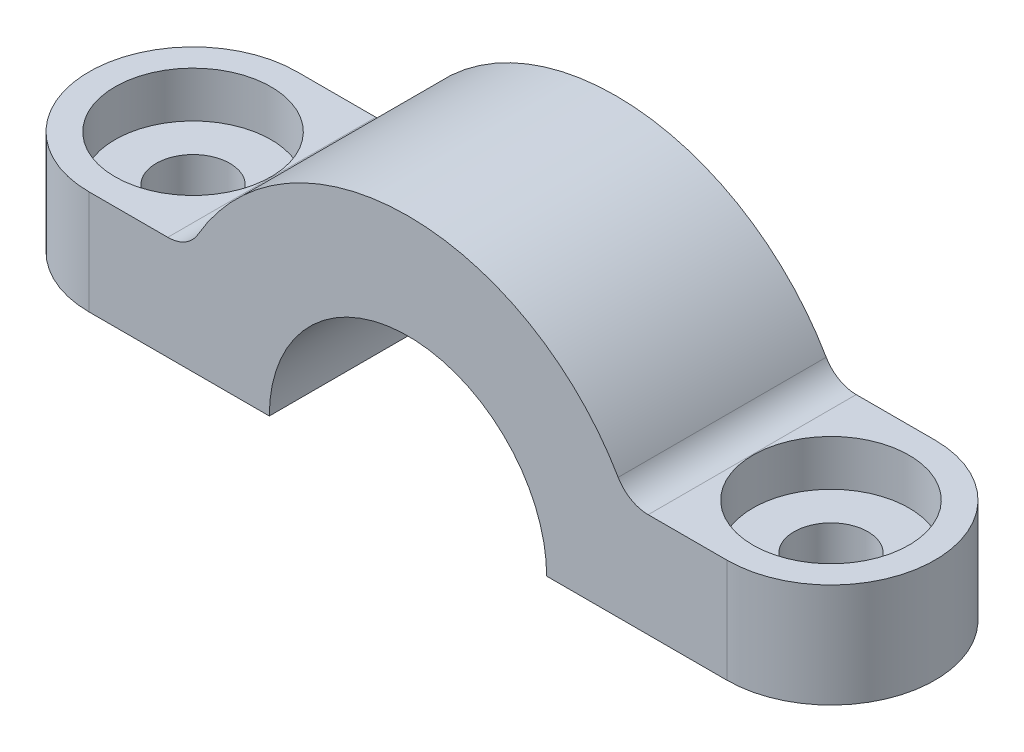
ISO-10303-21;
HEADER;
FILE_DESCRIPTION(('STEP AP214'),'2;1');
FILE_NAME('part.step','',(''),(''),'','','');
FILE_SCHEMA(('AUTOMOTIVE_DESIGN { 1 0 10303 214 1 1 1 1 }'));
ENDSEC;
DATA;
#1=APPLICATION_CONTEXT('core data for automotive mechanical design processes');
#2=APPLICATION_PROTOCOL_DEFINITION('international standard','automotive_design',2000,#1);
#3=PRODUCT_CONTEXT('',#1,'mechanical');
#4=PRODUCT('Part','Part','',(#3));
#5=PRODUCT_RELATED_PRODUCT_CATEGORY('part','',(#4));
#6=PRODUCT_DEFINITION_FORMATION('','',#4);
#7=PRODUCT_DEFINITION_CONTEXT('part definition',#1,'design');
#8=PRODUCT_DEFINITION('design','',#6,#7);
#9=PRODUCT_DEFINITION_SHAPE('','',#8);
#10=(LENGTH_UNIT() NAMED_UNIT(*) SI_UNIT(.MILLI.,.METRE.));
#11=(NAMED_UNIT(*) PLANE_ANGLE_UNIT() SI_UNIT($,.RADIAN.));
#12=(NAMED_UNIT(*) SI_UNIT($,.STERADIAN.) SOLID_ANGLE_UNIT());
#13=UNCERTAINTY_MEASURE_WITH_UNIT(LENGTH_MEASURE(1.E-05),#10,'distance_accuracy_value','');
#14=(GEOMETRIC_REPRESENTATION_CONTEXT(3) GLOBAL_UNCERTAINTY_ASSIGNED_CONTEXT((#13)) GLOBAL_UNIT_ASSIGNED_CONTEXT((#10,
#11,#12)) REPRESENTATION_CONTEXT('',''));
#15=CARTESIAN_POINT('',(0.,0.,0.));
#16=DIRECTION('',(0.,0.,1.));
#17=DIRECTION('',(1.,0.,0.));
#18=AXIS2_PLACEMENT_3D('',#15,#16,#17);
#19=CARTESIAN_POINT('',(0.,0.,9.525));
#20=DIRECTION('',(0.,0.,-1.));
#21=DIRECTION('',(-1.,0.,0.));
#22=AXIS2_PLACEMENT_3D('',#19,#20,#21);
#23=CYLINDRICAL_SURFACE('',#22,22.225);
#24=CARTESIAN_POINT('',(0.,0.,9.525));
#25=DIRECTION('',(0.,0.,1.));
#26=DIRECTION('',(-1.,0.,0.));
#27=AXIS2_PLACEMENT_3D('',#24,#25,#26);
#28=CIRCLE('',#27,22.225);
#29=CARTESIAN_POINT('',(19.2474145991092,11.1125,9.52499999999999));
#30=VERTEX_POINT('',#29);
#31=CARTESIAN_POINT('',(-19.2474145991092,11.1125,9.52500000000001));
#32=VERTEX_POINT('',#31);
#33=EDGE_CURVE('E162',#30,#32,#28,.T.);
#34=ORIENTED_EDGE('',*,*,#33,.F.);
#35=DIRECTION('',(0.,0.,-1.));
#36=VECTOR('',#35,1.);
#37=CARTESIAN_POINT('',(19.2474145991092,11.1125,9.52499999999999));
#38=LINE('',#37,#36);
#39=CARTESIAN_POINT('',(19.2474145991092,11.1125,-9.52500000000001));
#40=VERTEX_POINT('',#39);
#41=EDGE_CURVE('E187',#30,#40,#38,.T.);
#42=ORIENTED_EDGE('',*,*,#41,.T.);
#43=CARTESIAN_POINT('',(0.,0.,-9.52500000000001));
#44=DIRECTION('',(0.,0.,1.));
#45=DIRECTION('',(-1.,0.,0.));
#46=AXIS2_PLACEMENT_3D('',#43,#44,#45);
#47=CIRCLE('',#46,22.225);
#48=CARTESIAN_POINT('',(-19.2474145991092,11.1125,-9.52500000000001));
#49=VERTEX_POINT('',#48);
#50=EDGE_CURVE('E159',#40,#49,#47,.T.);
#51=ORIENTED_EDGE('',*,*,#50,.T.);
#52=DIRECTION('',(0.,0.,-1.));
#53=VECTOR('',#52,1.);
#54=CARTESIAN_POINT('',(-19.2474145991092,11.1125,9.52500000000001));
#55=LINE('',#54,#53);
#56=EDGE_CURVE('E184',#49,#32,#55,.F.);
#57=ORIENTED_EDGE('',*,*,#56,.T.);
#58=EDGE_LOOP('',(#34,#42,#51,#57));
#59=FACE_BOUND('',#58,.T.);
#60=ADVANCED_FACE('F36',(#59),#23,.T.);
#61=CARTESIAN_POINT('',(-22.225,0.,9.525));
#62=DIRECTION('',(0.,1.,0.));
#63=DIRECTION('',(0.,0.,1.));
#64=AXIS2_PLACEMENT_3D('',#61,#62,#63);
#65=PLANE('',#64);
#66=CARTESIAN_POINT('',(-29.21,0.,0.));
#67=DIRECTION('',(0.,1.,0.));
#68=DIRECTION('',(0.,0.,1.));
#69=AXIS2_PLACEMENT_3D('',#66,#67,#68);
#70=CIRCLE('',#69,3.37820000000001);
#71=CARTESIAN_POINT('',(-29.21,0.,3.3782));
#72=VERTEX_POINT('',#71);
#73=EDGE_CURVE('E364',#72,#72,#70,.T.);
#74=ORIENTED_EDGE('',*,*,#73,.T.);
#75=EDGE_LOOP('',(#74));
#76=FACE_BOUND('',#75,.T.);
#77=DIRECTION('',(1.,0.,0.));
#78=VECTOR('',#77,1.);
#79=CARTESIAN_POINT('',(-22.2250000000001,0.,-9.52499999999999));
#80=LINE('',#79,#78);
#81=CARTESIAN_POINT('',(-29.21,0.,-9.52500000000001));
#82=VERTEX_POINT('',#81);
#83=CARTESIAN_POINT('',(-12.7,0.,-9.52500000000001));
#84=VERTEX_POINT('',#83);
#85=EDGE_CURVE('E173',#82,#84,#80,.T.);
#86=ORIENTED_EDGE('',*,*,#85,.T.);
#87=DIRECTION('',(0.,0.,-1.));
#88=VECTOR('',#87,1.);
#89=CARTESIAN_POINT('',(-12.7,0.,9.525));
#90=LINE('',#89,#88);
#91=CARTESIAN_POINT('',(-12.7,0.,9.525));
#92=VERTEX_POINT('',#91);
#93=EDGE_CURVE('E180',#92,#84,#90,.T.);
#94=ORIENTED_EDGE('',*,*,#93,.F.);
#95=DIRECTION('',(1.,0.,0.));
#96=VECTOR('',#95,1.);
#97=CARTESIAN_POINT('',(-22.225,0.,9.525));
#98=LINE('',#97,#96);
#99=CARTESIAN_POINT('',(-29.21,0.,9.52499999999999));
#100=VERTEX_POINT('',#99);
#101=EDGE_CURVE('E164',#100,#92,#98,.T.);
#102=ORIENTED_EDGE('',*,*,#101,.F.);
#103=CARTESIAN_POINT('',(-29.21,0.,0.));
#104=DIRECTION('',(0.,-1.,0.));
#105=DIRECTION('',(0.,0.,1.));
#106=AXIS2_PLACEMENT_3D('',#103,#104,#105);
#107=CIRCLE('',#106,9.525);
#108=EDGE_CURVE('E144',#100,#82,#107,.T.);
#109=ORIENTED_EDGE('',*,*,#108,.T.);
#110=EDGE_LOOP('',(#86,#94,#102,#109));
#111=FACE_BOUND('',#110,.T.);
#112=ADVANCED_FACE('F216',(#76,#111),#65,.F.);
#113=CARTESIAN_POINT('',(0.,0.,9.525));
#114=DIRECTION('',(0.,0.,-1.));
#115=DIRECTION('',(-1.,0.,0.));
#116=AXIS2_PLACEMENT_3D('',#113,#114,#115);
#117=CYLINDRICAL_SURFACE('',#116,12.7);
#118=CARTESIAN_POINT('',(0.,0.,-9.52500000000001));
#119=DIRECTION('',(0.,0.,-1.));
#120=DIRECTION('',(1.,0.,0.));
#121=AXIS2_PLACEMENT_3D('',#118,#119,#120);
#122=CIRCLE('',#121,12.7);
#123=CARTESIAN_POINT('',(12.7,0.,-9.52500000000001));
#124=VERTEX_POINT('',#123);
#125=EDGE_CURVE('E175',#84,#124,#122,.T.);
#126=ORIENTED_EDGE('',*,*,#125,.T.);
#127=DIRECTION('',(0.,0.,-1.));
#128=VECTOR('',#127,1.);
#129=CARTESIAN_POINT('',(12.7,0.,9.525));
#130=LINE('',#129,#128);
#131=CARTESIAN_POINT('',(12.7,0.,9.525));
#132=VERTEX_POINT('',#131);
#133=EDGE_CURVE('E170',#132,#124,#130,.T.);
#134=ORIENTED_EDGE('',*,*,#133,.F.);
#135=CARTESIAN_POINT('',(0.,0.,9.525));
#136=DIRECTION('',(0.,0.,-1.));
#137=DIRECTION('',(1.,0.,0.));
#138=AXIS2_PLACEMENT_3D('',#135,#136,#137);
#139=CIRCLE('',#138,12.7);
#140=EDGE_CURVE('E167',#92,#132,#139,.T.);
#141=ORIENTED_EDGE('',*,*,#140,.F.);
#142=ORIENTED_EDGE('',*,*,#93,.T.);
#143=EDGE_LOOP('',(#126,#134,#141,#142));
#144=FACE_BOUND('',#143,.T.);
#145=ADVANCED_FACE('F219',(#144),#117,.F.);
#146=CARTESIAN_POINT('',(12.7,0.,9.525));
#147=DIRECTION('',(0.,1.,0.));
#148=DIRECTION('',(0.,0.,1.));
#149=AXIS2_PLACEMENT_3D('',#146,#147,#148);
#150=PLANE('',#149);
#151=CARTESIAN_POINT('',(29.21,0.,0.));
#152=DIRECTION('',(0.,1.,0.));
#153=DIRECTION('',(0.,0.,1.));
#154=AXIS2_PLACEMENT_3D('',#151,#152,#153);
#155=CIRCLE('',#154,3.37820000000001);
#156=CARTESIAN_POINT('',(29.21,0.,3.37820000000002));
#157=VERTEX_POINT('',#156);
#158=EDGE_CURVE('E138',#157,#157,#155,.T.);
#159=ORIENTED_EDGE('',*,*,#158,.T.);
#160=EDGE_LOOP('',(#159));
#161=FACE_BOUND('',#160,.T.);
#162=DIRECTION('',(1.,0.,0.));
#163=VECTOR('',#162,1.);
#164=CARTESIAN_POINT('',(12.7,0.,-9.52500000000001));
#165=LINE('',#164,#163);
#166=CARTESIAN_POINT('',(29.21,0.,-9.525));
#167=VERTEX_POINT('',#166);
#168=EDGE_CURVE('E165',#124,#167,#165,.T.);
#169=ORIENTED_EDGE('',*,*,#168,.T.);
#170=CARTESIAN_POINT('',(29.21,0.,0.));
#171=DIRECTION('',(0.,-1.,0.));
#172=DIRECTION('',(0.,0.,-1.));
#173=AXIS2_PLACEMENT_3D('',#170,#171,#172);
#174=CIRCLE('',#173,9.525);
#175=CARTESIAN_POINT('',(29.21,0.,9.525));
#176=VERTEX_POINT('',#175);
#177=EDGE_CURVE('E136',#167,#176,#174,.T.);
#178=ORIENTED_EDGE('',*,*,#177,.T.);
#179=DIRECTION('',(1.,0.,0.));
#180=VECTOR('',#179,1.);
#181=CARTESIAN_POINT('',(12.7,0.,9.525));
#182=LINE('',#181,#180);
#183=EDGE_CURVE('E116',#132,#176,#182,.T.);
#184=ORIENTED_EDGE('',*,*,#183,.F.);
#185=ORIENTED_EDGE('',*,*,#133,.T.);
#186=EDGE_LOOP('',(#169,#178,#184,#185));
#187=FACE_BOUND('',#186,.T.);
#188=ADVANCED_FACE('F221',(#161,#187),#150,.F.);
#189=CARTESIAN_POINT('',(0.,0.,9.525));
#190=DIRECTION('',(0.,0.,-1.));
#191=DIRECTION('',(-1.,0.,0.));
#192=AXIS2_PLACEMENT_3D('',#189,#190,#191);
#193=PLANE('',#192);
#194=ORIENTED_EDGE('',*,*,#140,.T.);
#195=ORIENTED_EDGE('',*,*,#183,.T.);
#196=DIRECTION('',(0.,-1.,0.));
#197=VECTOR('',#196,1.);
#198=CARTESIAN_POINT('',(29.21,9.52499999999996,9.525));
#199=LINE('',#198,#197);
#200=CARTESIAN_POINT('',(29.21,9.52499999999996,9.525));
#201=VERTEX_POINT('',#200);
#202=EDGE_CURVE('E111',#201,#176,#199,.T.);
#203=ORIENTED_EDGE('',*,*,#202,.F.);
#204=DIRECTION('',(-1.,0.,0.));
#205=VECTOR('',#204,1.);
#206=CARTESIAN_POINT('',(29.21,9.52499999999996,9.525));
#207=LINE('',#206,#205);
#208=CARTESIAN_POINT('',(21.9970452561248,9.52500000000001,9.52500000000001));
#209=VERTEX_POINT('',#208);
#210=EDGE_CURVE('E114',#201,#209,#207,.T.);
#211=ORIENTED_EDGE('',*,*,#210,.T.);
#212=CARTESIAN_POINT('',(21.9970452561248,12.6999999999999,9.52500000000002));
#213=DIRECTION('',(0.,0.,-1.));
#214=DIRECTION('',(-1.,0.,0.));
#215=AXIS2_PLACEMENT_3D('',#212,#213,#214);
#216=CIRCLE('',#215,3.175);
#217=EDGE_CURVE('E190',#209,#30,#216,.T.);
#218=ORIENTED_EDGE('',*,*,#217,.T.);
#219=ORIENTED_EDGE('',*,*,#33,.T.);
#220=CARTESIAN_POINT('',(-21.9970452561248,12.6999999999999,9.52499999999998));
#221=DIRECTION('',(0.,0.,-1.));
#222=DIRECTION('',(-1.,0.,0.));
#223=AXIS2_PLACEMENT_3D('',#220,#221,#222);
#224=CIRCLE('',#223,3.175);
#225=CARTESIAN_POINT('',(-21.9970452561248,9.52499999999996,9.52500000000001));
#226=VERTEX_POINT('',#225);
#227=EDGE_CURVE('E44',#32,#226,#224,.T.);
#228=ORIENTED_EDGE('',*,*,#227,.T.);
#229=DIRECTION('',(-1.,0.,0.));
#230=VECTOR('',#229,1.);
#231=CARTESIAN_POINT('',(-29.21,9.52499999999996,9.52499999999999));
#232=LINE('',#231,#230);
#233=CARTESIAN_POINT('',(-29.21,9.52499999999996,9.52499999999999));
#234=VERTEX_POINT('',#233);
#235=EDGE_CURVE('E146',#226,#234,#232,.T.);
#236=ORIENTED_EDGE('',*,*,#235,.T.);
#237=DIRECTION('',(0.,-1.,0.));
#238=VECTOR('',#237,1.);
#239=CARTESIAN_POINT('',(-29.21,9.52499999999996,9.52499999999999));
#240=LINE('',#239,#238);
#241=EDGE_CURVE('E153',#234,#100,#240,.T.);
#242=ORIENTED_EDGE('',*,*,#241,.T.);
#243=ORIENTED_EDGE('',*,*,#101,.T.);
#244=EDGE_LOOP('',(#194,#195,#203,#211,#218,#219,#228,#236,#242,#243));
#245=FACE_BOUND('',#244,.T.);
#246=ADVANCED_FACE('F113',(#245),#193,.F.);
#247=CARTESIAN_POINT('',(0.,0.,-9.52500000000001));
#248=DIRECTION('',(0.,0.,-1.));
#249=DIRECTION('',(-1.,0.,0.));
#250=AXIS2_PLACEMENT_3D('',#247,#248,#249);
#251=PLANE('',#250);
#252=ORIENTED_EDGE('',*,*,#168,.F.);
#253=ORIENTED_EDGE('',*,*,#125,.F.);
#254=ORIENTED_EDGE('',*,*,#85,.F.);
#255=DIRECTION('',(0.,-1.,0.));
#256=VECTOR('',#255,1.);
#257=CARTESIAN_POINT('',(-29.21,9.52499999999996,-9.52500000000001));
#258=LINE('',#257,#256);
#259=CARTESIAN_POINT('',(-29.21,9.52499999999996,-9.52500000000001));
#260=VERTEX_POINT('',#259);
#261=EDGE_CURVE('E156',#260,#82,#258,.T.);
#262=ORIENTED_EDGE('',*,*,#261,.F.);
#263=DIRECTION('',(1.,0.,0.));
#264=VECTOR('',#263,1.);
#265=CARTESIAN_POINT('',(-12.7,9.52500000000001,-9.52500000000001));
#266=LINE('',#265,#264);
#267=CARTESIAN_POINT('',(-21.9970452561248,9.52500000000001,-9.52500000000001));
#268=VERTEX_POINT('',#267);
#269=EDGE_CURVE('E151',#260,#268,#266,.T.);
#270=ORIENTED_EDGE('',*,*,#269,.T.);
#271=CARTESIAN_POINT('',(-21.9970452561248,12.6999999999999,-9.52500000000001));
#272=DIRECTION('',(0.,0.,-1.));
#273=DIRECTION('',(-1.,0.,0.));
#274=AXIS2_PLACEMENT_3D('',#271,#272,#273);
#275=CIRCLE('',#274,3.175);
#276=EDGE_CURVE('E11',#268,#49,#275,.F.);
#277=ORIENTED_EDGE('',*,*,#276,.T.);
#278=ORIENTED_EDGE('',*,*,#50,.F.);
#279=CARTESIAN_POINT('',(21.9970452561248,12.7,-9.525));
#280=DIRECTION('',(0.,0.,-1.));
#281=DIRECTION('',(-1.,0.,0.));
#282=AXIS2_PLACEMENT_3D('',#279,#280,#281);
#283=CIRCLE('',#282,3.175);
#284=CARTESIAN_POINT('',(21.9970452561248,9.52500000000001,-9.525));
#285=VERTEX_POINT('',#284);
#286=EDGE_CURVE('E192',#40,#285,#283,.F.);
#287=ORIENTED_EDGE('',*,*,#286,.T.);
#288=DIRECTION('',(1.,0.,0.));
#289=VECTOR('',#288,1.);
#290=CARTESIAN_POINT('',(12.7,9.52500000000006,-9.52500000000001));
#291=LINE('',#290,#289);
#292=CARTESIAN_POINT('',(29.21,9.52500000000001,-9.52499999999999));
#293=VERTEX_POINT('',#292);
#294=EDGE_CURVE('E122',#285,#293,#291,.T.);
#295=ORIENTED_EDGE('',*,*,#294,.T.);
#296=DIRECTION('',(0.,-1.,0.));
#297=VECTOR('',#296,1.);
#298=CARTESIAN_POINT('',(29.21,9.52500000000001,-9.52499999999999));
#299=LINE('',#298,#297);
#300=EDGE_CURVE('E121',#293,#167,#299,.T.);
#301=ORIENTED_EDGE('',*,*,#300,.T.);
#302=EDGE_LOOP('',(#252,#253,#254,#262,#270,#277,#278,#287,#295,#301));
#303=FACE_BOUND('',#302,.T.);
#304=ADVANCED_FACE('F197',(#303),#251,.T.);
#305=CARTESIAN_POINT('',(-29.21,9.52499999999996,0.));
#306=DIRECTION('',(0.,1.,0.));
#307=DIRECTION('',(0.,0.,1.));
#308=AXIS2_PLACEMENT_3D('',#305,#306,#307);
#309=PLANE('',#308);
#310=CARTESIAN_POINT('',(-29.21,9.52499999999996,0.));
#311=DIRECTION('',(0.,1.,0.));
#312=DIRECTION('',(0.,0.,1.));
#313=AXIS2_PLACEMENT_3D('',#310,#311,#312);
#314=CIRCLE('',#313,7.14374999999999);
#315=CARTESIAN_POINT('',(-29.21,9.52499999999996,7.14374999999998));
#316=VERTEX_POINT('',#315);
#317=EDGE_CURVE('E357',#316,#316,#314,.T.);
#318=ORIENTED_EDGE('',*,*,#317,.F.);
#319=EDGE_LOOP('',(#318));
#320=FACE_BOUND('',#319,.T.);
#321=ORIENTED_EDGE('',*,*,#235,.F.);
#322=DIRECTION('',(0.,0.,-1.));
#323=VECTOR('',#322,1.);
#324=CARTESIAN_POINT('',(-21.9970452561248,9.52500000000001,0.));
#325=LINE('',#324,#323);
#326=EDGE_CURVE('E57',#226,#268,#325,.T.);
#327=ORIENTED_EDGE('',*,*,#326,.T.);
#328=ORIENTED_EDGE('',*,*,#269,.F.);
#329=CARTESIAN_POINT('',(-29.21,9.52499999999996,0.));
#330=DIRECTION('',(0.,-1.,0.));
#331=DIRECTION('',(0.,0.,1.));
#332=AXIS2_PLACEMENT_3D('',#329,#330,#331);
#333=CIRCLE('',#332,9.525);
#334=EDGE_CURVE('E148',#234,#260,#333,.T.);
#335=ORIENTED_EDGE('',*,*,#334,.F.);
#336=EDGE_LOOP('',(#321,#327,#328,#335));
#337=FACE_BOUND('',#336,.T.);
#338=ADVANCED_FACE('F207',(#320,#337),#309,.T.);
#339=CARTESIAN_POINT('',(-29.21,9.52499999999996,0.));
#340=DIRECTION('',(0.,-1.,0.));
#341=DIRECTION('',(0.,0.,-1.));
#342=AXIS2_PLACEMENT_3D('',#339,#340,#341);
#343=CYLINDRICAL_SURFACE('',#342,9.525);
#344=ORIENTED_EDGE('',*,*,#108,.F.);
#345=ORIENTED_EDGE('',*,*,#241,.F.);
#346=ORIENTED_EDGE('',*,*,#334,.T.);
#347=ORIENTED_EDGE('',*,*,#261,.T.);
#348=EDGE_LOOP('',(#344,#345,#346,#347));
#349=FACE_BOUND('',#348,.T.);
#350=ADVANCED_FACE('F211',(#349),#343,.T.);
#351=CARTESIAN_POINT('',(29.2100000000001,9.52500000000001,0.));
#352=DIRECTION('',(0.,-1.,0.));
#353=DIRECTION('',(0.,0.,-1.));
#354=AXIS2_PLACEMENT_3D('',#351,#352,#353);
#355=PLANE('',#354);
#356=CARTESIAN_POINT('',(29.2100000000001,9.52500000000001,0.));
#357=DIRECTION('',(0.,1.,0.));
#358=DIRECTION('',(0.,0.,1.));
#359=AXIS2_PLACEMENT_3D('',#356,#357,#358);
#360=CIRCLE('',#359,7.14374999999999);
#361=CARTESIAN_POINT('',(29.2100000000001,9.52500000000001,7.14374999999999));
#362=VERTEX_POINT('',#361);
#363=EDGE_CURVE('E367',#362,#362,#360,.T.);
#364=ORIENTED_EDGE('',*,*,#363,.F.);
#365=EDGE_LOOP('',(#364));
#366=FACE_BOUND('',#365,.T.);
#367=ORIENTED_EDGE('',*,*,#294,.F.);
#368=DIRECTION('',(0.,0.,1.));
#369=VECTOR('',#368,1.);
#370=CARTESIAN_POINT('',(21.9970452561248,9.52500000000001,9.52500000000001));
#371=LINE('',#370,#369);
#372=EDGE_CURVE('E131',#285,#209,#371,.T.);
#373=ORIENTED_EDGE('',*,*,#372,.T.);
#374=ORIENTED_EDGE('',*,*,#210,.F.);
#375=CARTESIAN_POINT('',(29.2100000000001,9.52500000000001,0.));
#376=DIRECTION('',(0.,-1.,0.));
#377=DIRECTION('',(0.,0.,-1.));
#378=AXIS2_PLACEMENT_3D('',#375,#376,#377);
#379=CIRCLE('',#378,9.525);
#380=EDGE_CURVE('E129',#293,#201,#379,.T.);
#381=ORIENTED_EDGE('',*,*,#380,.F.);
#382=EDGE_LOOP('',(#367,#373,#374,#381));
#383=FACE_BOUND('',#382,.T.);
#384=ADVANCED_FACE('F128',(#366,#383),#355,.F.);
#385=CARTESIAN_POINT('',(29.2100000000001,9.52500000000001,0.));
#386=DIRECTION('',(0.,-1.,0.));
#387=DIRECTION('',(0.,0.,-1.));
#388=AXIS2_PLACEMENT_3D('',#385,#386,#387);
#389=CYLINDRICAL_SURFACE('',#388,9.525);
#390=ORIENTED_EDGE('',*,*,#177,.F.);
#391=ORIENTED_EDGE('',*,*,#300,.F.);
#392=ORIENTED_EDGE('',*,*,#380,.T.);
#393=ORIENTED_EDGE('',*,*,#202,.T.);
#394=EDGE_LOOP('',(#390,#391,#392,#393));
#395=FACE_BOUND('',#394,.T.);
#396=ADVANCED_FACE('F134',(#395),#389,.T.);
#397=CARTESIAN_POINT('',(21.9970452561248,12.6999999999999,9.52500000000002));
#398=DIRECTION('',(0.,0.,-1.));
#399=DIRECTION('',(-1.,0.,0.));
#400=AXIS2_PLACEMENT_3D('',#397,#398,#399);
#401=CYLINDRICAL_SURFACE('',#400,3.175);
#402=ORIENTED_EDGE('',*,*,#286,.F.);
#403=ORIENTED_EDGE('',*,*,#41,.F.);
#404=ORIENTED_EDGE('',*,*,#217,.F.);
#405=ORIENTED_EDGE('',*,*,#372,.F.);
#406=EDGE_LOOP('',(#402,#403,#404,#405));
#407=FACE_BOUND('',#406,.T.);
#408=ADVANCED_FACE('F200',(#407),#401,.F.);
#409=CARTESIAN_POINT('',(-21.9970452561248,12.6999999999999,9.52499999999998));
#410=DIRECTION('',(0.,0.,-1.));
#411=DIRECTION('',(-1.,0.,0.));
#412=AXIS2_PLACEMENT_3D('',#409,#410,#411);
#413=CYLINDRICAL_SURFACE('',#412,3.175);
#414=ORIENTED_EDGE('',*,*,#276,.F.);
#415=ORIENTED_EDGE('',*,*,#326,.F.);
#416=ORIENTED_EDGE('',*,*,#227,.F.);
#417=ORIENTED_EDGE('',*,*,#56,.F.);
#418=EDGE_LOOP('',(#414,#415,#416,#417));
#419=FACE_BOUND('',#418,.T.);
#420=ADVANCED_FACE('F38',(#419),#413,.F.);
#421=CARTESIAN_POINT('',(29.2100000000001,9.52500000000001,0.));
#422=DIRECTION('',(0.,1.,0.));
#423=DIRECTION('',(0.,0.,1.));
#424=AXIS2_PLACEMENT_3D('',#421,#422,#423);
#425=CYLINDRICAL_SURFACE('',#424,3.3782);
#426=ORIENTED_EDGE('',*,*,#158,.F.);
#427=EDGE_LOOP('',(#426));
#428=FACE_BOUND('',#427,.T.);
#429=CARTESIAN_POINT('',(29.21,5.33399999999996,0.));
#430=DIRECTION('',(0.,1.,0.));
#431=DIRECTION('',(0.,0.,1.));
#432=AXIS2_PLACEMENT_3D('',#429,#430,#431);
#433=CIRCLE('',#432,3.3782);
#434=CARTESIAN_POINT('',(29.21,5.33399999999996,3.37820000000001));
#435=VERTEX_POINT('',#434);
#436=EDGE_CURVE('E372',#435,#435,#433,.T.);
#437=ORIENTED_EDGE('',*,*,#436,.T.);
#438=EDGE_LOOP('',(#437));
#439=FACE_BOUND('',#438,.T.);
#440=ADVANCED_FACE('F245',(#428,#439),#425,.F.);
#441=CARTESIAN_POINT('',(32.5882,5.334,0.));
#442=DIRECTION('',(0.,-1.,0.));
#443=DIRECTION('',(0.,0.,-1.));
#444=AXIS2_PLACEMENT_3D('',#441,#442,#443);
#445=PLANE('',#444);
#446=ORIENTED_EDGE('',*,*,#436,.F.);
#447=EDGE_LOOP('',(#446));
#448=FACE_BOUND('',#447,.T.);
#449=CARTESIAN_POINT('',(29.21,5.33399999999996,0.));
#450=DIRECTION('',(0.,1.,0.));
#451=DIRECTION('',(0.,0.,1.));
#452=AXIS2_PLACEMENT_3D('',#449,#450,#451);
#453=CIRCLE('',#452,7.14374999999999);
#454=CARTESIAN_POINT('',(29.21,5.33399999999995,7.14375));
#455=VERTEX_POINT('',#454);
#456=EDGE_CURVE('E370',#455,#455,#453,.T.);
#457=ORIENTED_EDGE('',*,*,#456,.T.);
#458=EDGE_LOOP('',(#457));
#459=FACE_BOUND('',#458,.T.);
#460=ADVANCED_FACE('F298',(#448,#459),#445,.F.);
#461=CARTESIAN_POINT('',(29.2100000000001,9.52500000000001,0.));
#462=DIRECTION('',(0.,1.,0.));
#463=DIRECTION('',(0.,0.,1.));
#464=AXIS2_PLACEMENT_3D('',#461,#462,#463);
#465=CYLINDRICAL_SURFACE('',#464,7.14374999999999);
#466=ORIENTED_EDGE('',*,*,#456,.F.);
#467=EDGE_LOOP('',(#466));
#468=FACE_BOUND('',#467,.T.);
#469=ORIENTED_EDGE('',*,*,#363,.T.);
#470=EDGE_LOOP('',(#469));
#471=FACE_BOUND('',#470,.T.);
#472=ADVANCED_FACE('F307',(#468,#471),#465,.F.);
#473=CARTESIAN_POINT('',(-29.21,9.52499999999996,0.));
#474=DIRECTION('',(0.,1.,0.));
#475=DIRECTION('',(0.,0.,1.));
#476=AXIS2_PLACEMENT_3D('',#473,#474,#475);
#477=CYLINDRICAL_SURFACE('',#476,3.3782);
#478=ORIENTED_EDGE('',*,*,#73,.F.);
#479=EDGE_LOOP('',(#478));
#480=FACE_BOUND('',#479,.T.);
#481=CARTESIAN_POINT('',(-29.2100000000001,5.334,0.));
#482=DIRECTION('',(0.,1.,0.));
#483=DIRECTION('',(0.,0.,1.));
#484=AXIS2_PLACEMENT_3D('',#481,#482,#483);
#485=CIRCLE('',#484,3.3782);
#486=CARTESIAN_POINT('',(-29.2100000000001,5.334,3.37819999999999));
#487=VERTEX_POINT('',#486);
#488=EDGE_CURVE('E359',#487,#487,#485,.T.);
#489=ORIENTED_EDGE('',*,*,#488,.T.);
#490=EDGE_LOOP('',(#489));
#491=FACE_BOUND('',#490,.T.);
#492=ADVANCED_FACE('F317',(#480,#491),#477,.F.);
#493=CARTESIAN_POINT('',(-25.8318,5.334,0.));
#494=DIRECTION('',(0.,-1.,0.));
#495=DIRECTION('',(0.,0.,-1.));
#496=AXIS2_PLACEMENT_3D('',#493,#494,#495);
#497=PLANE('',#496);
#498=ORIENTED_EDGE('',*,*,#488,.F.);
#499=EDGE_LOOP('',(#498));
#500=FACE_BOUND('',#499,.T.);
#501=CARTESIAN_POINT('',(-29.2100000000001,5.334,0.));
#502=DIRECTION('',(0.,1.,0.));
#503=DIRECTION('',(0.,0.,1.));
#504=AXIS2_PLACEMENT_3D('',#501,#502,#503);
#505=CIRCLE('',#504,7.14375);
#506=CARTESIAN_POINT('',(-29.2100000000001,5.334,7.14374999999999));
#507=VERTEX_POINT('',#506);
#508=EDGE_CURVE('E354',#507,#507,#505,.T.);
#509=ORIENTED_EDGE('',*,*,#508,.T.);
#510=EDGE_LOOP('',(#509));
#511=FACE_BOUND('',#510,.T.);
#512=ADVANCED_FACE('F327',(#500,#511),#497,.F.);
#513=CARTESIAN_POINT('',(-29.21,9.52499999999996,0.));
#514=DIRECTION('',(0.,1.,0.));
#515=DIRECTION('',(0.,0.,1.));
#516=AXIS2_PLACEMENT_3D('',#513,#514,#515);
#517=CYLINDRICAL_SURFACE('',#516,7.14375);
#518=ORIENTED_EDGE('',*,*,#508,.F.);
#519=EDGE_LOOP('',(#518));
#520=FACE_BOUND('',#519,.T.);
#521=ORIENTED_EDGE('',*,*,#317,.T.);
#522=EDGE_LOOP('',(#521));
#523=FACE_BOUND('',#522,.T.);
#524=ADVANCED_FACE('F337',(#520,#523),#517,.F.);
#525=CLOSED_SHELL('',(#60,#112,#145,#188,#246,#304,#338,#350,#384,#396,#408,#420,#440,#460,#472,
#492,#512,#524));
#526=MANIFOLD_SOLID_BREP('B2',#525);
#527=ADVANCED_BREP_SHAPE_REPRESENTATION('',(#18,#526),#14);
#528=SHAPE_DEFINITION_REPRESENTATION(#9,#527);
ENDSEC;
END-ISO-10303-21;
